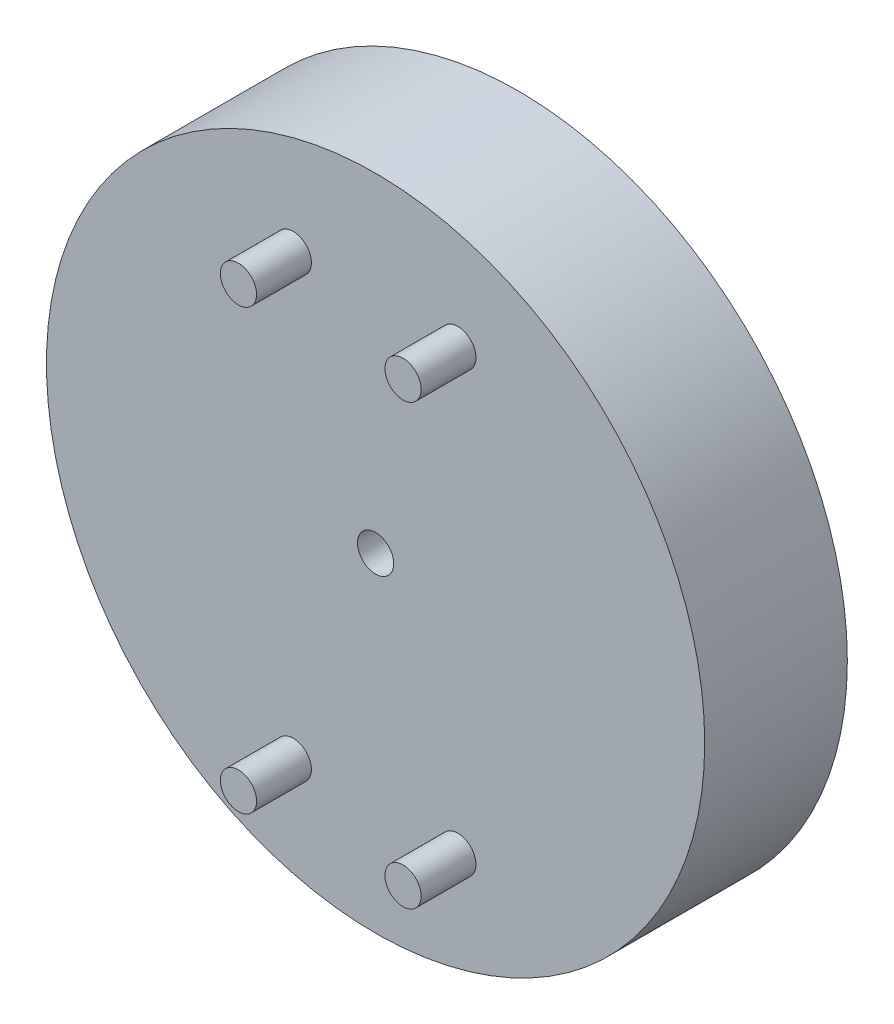
ISO-10303-21;
HEADER;
FILE_DESCRIPTION(('STEP AP214'),'2;1');
FILE_NAME('part.step','',(''),(''),'','','');
FILE_SCHEMA(('AUTOMOTIVE_DESIGN { 1 0 10303 214 1 1 1 1 }'));
ENDSEC;
DATA;
#1=APPLICATION_CONTEXT('core data for automotive mechanical design processes');
#2=APPLICATION_PROTOCOL_DEFINITION('international standard','automotive_design',2000,#1);
#3=PRODUCT_CONTEXT('',#1,'mechanical');
#4=PRODUCT('Part','Part','',(#3));
#5=PRODUCT_RELATED_PRODUCT_CATEGORY('part','',(#4));
#6=PRODUCT_DEFINITION_FORMATION('','',#4);
#7=PRODUCT_DEFINITION_CONTEXT('part definition',#1,'design');
#8=PRODUCT_DEFINITION('design','',#6,#7);
#9=PRODUCT_DEFINITION_SHAPE('','',#8);
#10=(LENGTH_UNIT() NAMED_UNIT(*) SI_UNIT(.MILLI.,.METRE.));
#11=(NAMED_UNIT(*) PLANE_ANGLE_UNIT() SI_UNIT($,.RADIAN.));
#12=(NAMED_UNIT(*) SI_UNIT($,.STERADIAN.) SOLID_ANGLE_UNIT());
#13=UNCERTAINTY_MEASURE_WITH_UNIT(LENGTH_MEASURE(1.E-05),#10,'distance_accuracy_value','');
#14=(GEOMETRIC_REPRESENTATION_CONTEXT(3) GLOBAL_UNCERTAINTY_ASSIGNED_CONTEXT((#13)) GLOBAL_UNIT_ASSIGNED_CONTEXT((#10,
#11,#12)) REPRESENTATION_CONTEXT('',''));
#15=CARTESIAN_POINT('',(0.,0.,0.));
#16=DIRECTION('',(0.,0.,1.));
#17=DIRECTION('',(1.,0.,0.));
#18=AXIS2_PLACEMENT_3D('',#15,#16,#17);
#19=CARTESIAN_POINT('',(0.,0.,-20.));
#20=DIRECTION('',(0.,0.,1.));
#21=DIRECTION('',(1.,0.,0.));
#22=AXIS2_PLACEMENT_3D('',#19,#20,#21);
#23=CYLINDRICAL_SURFACE('',#22,60.);
#24=CARTESIAN_POINT('',(0.,0.,-20.));
#25=DIRECTION('',(0.,0.,1.));
#26=DIRECTION('',(-1.,0.,0.));
#27=AXIS2_PLACEMENT_3D('',#24,#25,#26);
#28=CIRCLE('',#27,60.);
#29=CARTESIAN_POINT('',(60.,0.,-20.));
#30=VERTEX_POINT('',#29);
#31=EDGE_CURVE('E10',#30,#30,#28,.T.);
#32=CARTESIAN_POINT('',(0.,0.,6.));
#33=DIRECTION('',(0.,0.,1.));
#34=DIRECTION('',(-1.,0.,0.));
#35=AXIS2_PLACEMENT_3D('',#32,#33,#34);
#36=CIRCLE('',#35,60.);
#37=CARTESIAN_POINT('',(60.,0.,6.));
#38=VERTEX_POINT('',#37);
#39=EDGE_CURVE('E45',#38,#38,#36,.T.);
#40=CARTESIAN_POINT('',(60.,0.,-20.));
#41=CARTESIAN_POINT('',(60.,0.,-19.7291666666667));
#42=CARTESIAN_POINT('',(60.,0.,-19.4583333333333));
#43=CARTESIAN_POINT('',(60.,0.,-18.9166666666667));
#44=CARTESIAN_POINT('',(60.,0.,-18.6458333333333));
#45=CARTESIAN_POINT('',(60.,0.,-18.1041666666667));
#46=CARTESIAN_POINT('',(60.,0.,-17.8333333333333));
#47=CARTESIAN_POINT('',(60.,0.,-17.2916666666667));
#48=CARTESIAN_POINT('',(60.,0.,-17.0208333333333));
#49=CARTESIAN_POINT('',(60.,0.,-16.4791666666667));
#50=CARTESIAN_POINT('',(60.,0.,-16.2083333333333));
#51=CARTESIAN_POINT('',(60.,0.,-15.6666666666667));
#52=CARTESIAN_POINT('',(60.,0.,-15.3958333333333));
#53=CARTESIAN_POINT('',(60.,0.,-14.8541666666667));
#54=CARTESIAN_POINT('',(60.,0.,-14.5833333333333));
#55=CARTESIAN_POINT('',(60.,0.,-14.0416666666667));
#56=CARTESIAN_POINT('',(60.,0.,-13.7708333333333));
#57=CARTESIAN_POINT('',(60.,0.,-13.2291666666667));
#58=CARTESIAN_POINT('',(60.,0.,-12.9583333333333));
#59=CARTESIAN_POINT('',(60.,0.,-12.4166666666667));
#60=CARTESIAN_POINT('',(60.,0.,-12.1458333333333));
#61=CARTESIAN_POINT('',(60.,0.,-11.6041666666667));
#62=CARTESIAN_POINT('',(60.,0.,-11.3333333333333));
#63=CARTESIAN_POINT('',(60.,0.,-10.7916666666667));
#64=CARTESIAN_POINT('',(60.,0.,-10.5208333333333));
#65=CARTESIAN_POINT('',(60.,0.,-9.97916666666667));
#66=CARTESIAN_POINT('',(60.,0.,-9.70833333333333));
#67=CARTESIAN_POINT('',(60.,0.,-9.16666666666666));
#68=CARTESIAN_POINT('',(60.,0.,-8.89583333333333));
#69=CARTESIAN_POINT('',(60.,0.,-8.35416666666666));
#70=CARTESIAN_POINT('',(60.,0.,-8.08333333333333));
#71=CARTESIAN_POINT('',(60.,0.,-7.54166666666666));
#72=CARTESIAN_POINT('',(60.,0.,-7.27083333333333));
#73=CARTESIAN_POINT('',(60.,0.,-6.72916666666666));
#74=CARTESIAN_POINT('',(60.,0.,-6.45833333333333));
#75=CARTESIAN_POINT('',(60.,0.,-5.91666666666666));
#76=CARTESIAN_POINT('',(60.,0.,-5.64583333333333));
#77=CARTESIAN_POINT('',(60.,0.,-5.10416666666666));
#78=CARTESIAN_POINT('',(60.,0.,-4.83333333333333));
#79=CARTESIAN_POINT('',(60.,0.,-4.29166666666667));
#80=CARTESIAN_POINT('',(60.,0.,-4.02083333333333));
#81=CARTESIAN_POINT('',(60.,0.,-3.47916666666667));
#82=CARTESIAN_POINT('',(60.,0.,-3.20833333333333));
#83=CARTESIAN_POINT('',(60.,0.,-2.66666666666667));
#84=CARTESIAN_POINT('',(60.,0.,-2.39583333333333));
#85=CARTESIAN_POINT('',(60.,0.,-1.85416666666667));
#86=CARTESIAN_POINT('',(60.,0.,-1.58333333333333));
#87=CARTESIAN_POINT('',(60.,0.,-1.04166666666667));
#88=CARTESIAN_POINT('',(60.,0.,-0.770833333333334));
#89=CARTESIAN_POINT('',(60.,0.,-0.229166666666667));
#90=CARTESIAN_POINT('',(60.,0.,0.0416666666666667));
#91=CARTESIAN_POINT('',(60.,0.,0.583333333333334));
#92=CARTESIAN_POINT('',(60.,0.,0.854166666666667));
#93=CARTESIAN_POINT('',(60.,0.,1.39583333333333));
#94=CARTESIAN_POINT('',(60.,0.,1.66666666666667));
#95=CARTESIAN_POINT('',(60.,0.,2.20833333333334));
#96=CARTESIAN_POINT('',(60.,0.,2.47916666666667));
#97=CARTESIAN_POINT('',(60.,0.,3.02083333333333));
#98=CARTESIAN_POINT('',(60.,0.,3.29166666666667));
#99=CARTESIAN_POINT('',(60.,0.,3.83333333333333));
#100=CARTESIAN_POINT('',(60.,0.,4.10416666666667));
#101=CARTESIAN_POINT('',(60.,0.,4.64583333333333));
#102=CARTESIAN_POINT('',(60.,0.,4.91666666666667));
#103=CARTESIAN_POINT('',(60.,0.,5.45833333333333));
#104=CARTESIAN_POINT('',(60.,0.,5.72916666666667));
#105=CARTESIAN_POINT('',(60.,0.,6.));
#106=B_SPLINE_CURVE_WITH_KNOTS('',3,(#40,#41,#42,#43,#44,#45,#46,#47,#48,#49,#50,#51,#52,#53,
#54,#55,#56,#57,#58,#59,#60,#61,#62,#63,#64,#65,#66,#67,#68,#69,#70,#71,#72,#73,#74,#75,#76,#77,
#78,#79,#80,#81,#82,#83,#84,#85,#86,#87,#88,#89,#90,#91,#92,#93,#94,#95,#96,#97,#98,#99,#100,
#101,#102,#103,#104,#105),.UNSPECIFIED.,.F.,.F.,(4,2,2,2,2,2,2,2,2,2,2,2,2,2,2,2,2,2,2,2,2,2,2,
2,2,2,2,2,2,2,2,2,4),(0.,0.812500000000001,1.625,2.4375,3.25,4.0625,4.875,5.6875,6.5,7.3125,
8.125,8.9375,9.75,10.5625,11.375,12.1875,13.,13.8125,14.625,15.4375,16.25,17.0625,17.875,
18.6875,19.5,20.3125,21.125,21.9375,22.75,23.5625,24.375,25.1875,26.),.UNSPECIFIED.);
#107=EDGE_CURVE('BSEAM37',#30,#38,#106,.T.);
#108=ORIENTED_EDGE('',*,*,#31,.T.);
#109=ORIENTED_EDGE('',*,*,#39,.F.);
#110=ORIENTED_EDGE('',*,*,#107,.T.);
#111=ORIENTED_EDGE('',*,*,#107,.F.);
#112=EDGE_LOOP('',(#108,#110,#109,#111));
#113=FACE_BOUND('',#112,.T.);
#114=ADVANCED_FACE('F37',(#113),#23,.T.);
#115=CARTESIAN_POINT('',(0.,0.,-20.));
#116=DIRECTION('',(0.,0.,-1.));
#117=DIRECTION('',(-1.,0.,0.));
#118=AXIS2_PLACEMENT_3D('',#115,#116,#117);
#119=PLANE('',#118);
#120=CARTESIAN_POINT('',(0.,0.,-20.));
#121=DIRECTION('',(0.,0.,1.));
#122=DIRECTION('',(-1.,0.,0.));
#123=AXIS2_PLACEMENT_3D('',#120,#121,#122);
#124=CIRCLE('',#123,3.3);
#125=CARTESIAN_POINT('',(3.3,0.,-20.));
#126=VERTEX_POINT('',#125);
#127=EDGE_CURVE('E51',#126,#126,#124,.T.);
#128=ORIENTED_EDGE('',*,*,#127,.T.);
#129=EDGE_LOOP('',(#128));
#130=FACE_BOUND('',#129,.T.);
#131=ORIENTED_EDGE('',*,*,#31,.F.);
#132=EDGE_LOOP('',(#131));
#133=FACE_BOUND('',#132,.T.);
#134=ADVANCED_FACE('F100',(#130,#133),#119,.T.);
#135=CARTESIAN_POINT('',(0.,0.,6.));
#136=DIRECTION('',(0.,0.,-1.));
#137=DIRECTION('',(-1.,0.,0.));
#138=AXIS2_PLACEMENT_3D('',#135,#136,#137);
#139=PLANE('',#138);
#140=CARTESIAN_POINT('',(-14.999999494815,-40.,6.));
#141=DIRECTION('',(0.,0.,-1.));
#142=DIRECTION('',(-1.,0.,0.));
#143=AXIS2_PLACEMENT_3D('',#140,#141,#142);
#144=CIRCLE('',#143,3.3);
#145=CARTESIAN_POINT('',(-18.299999494815,-40.,6.));
#146=VERTEX_POINT('',#145);
#147=EDGE_CURVE('E40',#146,#146,#144,.T.);
#148=ORIENTED_EDGE('',*,*,#147,.T.);
#149=EDGE_LOOP('',(#148));
#150=FACE_BOUND('',#149,.T.);
#151=CARTESIAN_POINT('',(14.999999494815,-40.,6.));
#152=DIRECTION('',(0.,0.,-1.));
#153=DIRECTION('',(-1.,0.,0.));
#154=AXIS2_PLACEMENT_3D('',#151,#152,#153);
#155=CIRCLE('',#154,3.3);
#156=CARTESIAN_POINT('',(11.699999494815,-40.,6.));
#157=VERTEX_POINT('',#156);
#158=EDGE_CURVE('E66',#157,#157,#155,.T.);
#159=ORIENTED_EDGE('',*,*,#158,.T.);
#160=EDGE_LOOP('',(#159));
#161=FACE_BOUND('',#160,.T.);
#162=CARTESIAN_POINT('',(-14.999999494815,40.,6.));
#163=DIRECTION('',(0.,0.,-1.));
#164=DIRECTION('',(-1.,0.,0.));
#165=AXIS2_PLACEMENT_3D('',#162,#163,#164);
#166=CIRCLE('',#165,3.3);
#167=CARTESIAN_POINT('',(-18.299999494815,40.,6.));
#168=VERTEX_POINT('',#167);
#169=EDGE_CURVE('E62',#168,#168,#166,.T.);
#170=ORIENTED_EDGE('',*,*,#169,.T.);
#171=EDGE_LOOP('',(#170));
#172=FACE_BOUND('',#171,.T.);
#173=CARTESIAN_POINT('',(14.999999494815,40.,6.));
#174=DIRECTION('',(0.,0.,-1.));
#175=DIRECTION('',(-1.,0.,0.));
#176=AXIS2_PLACEMENT_3D('',#173,#174,#175);
#177=CIRCLE('',#176,3.3);
#178=CARTESIAN_POINT('',(11.699999494815,40.,6.));
#179=VERTEX_POINT('',#178);
#180=EDGE_CURVE('E57',#179,#179,#177,.T.);
#181=ORIENTED_EDGE('',*,*,#180,.T.);
#182=EDGE_LOOP('',(#181));
#183=FACE_BOUND('',#182,.T.);
#184=CARTESIAN_POINT('',(0.,0.,6.));
#185=DIRECTION('',(0.,0.,1.));
#186=DIRECTION('',(-1.,0.,0.));
#187=AXIS2_PLACEMENT_3D('',#184,#185,#186);
#188=CIRCLE('',#187,3.3);
#189=CARTESIAN_POINT('',(3.3,0.,6.));
#190=VERTEX_POINT('',#189);
#191=EDGE_CURVE('E54',#190,#190,#188,.T.);
#192=ORIENTED_EDGE('',*,*,#191,.F.);
#193=EDGE_LOOP('',(#192));
#194=FACE_BOUND('',#193,.T.);
#195=ORIENTED_EDGE('',*,*,#39,.T.);
#196=EDGE_LOOP('',(#195));
#197=FACE_BOUND('',#196,.T.);
#198=ADVANCED_FACE('F97',(#150,#161,#172,#183,#194,#197),#139,.F.);
#199=CARTESIAN_POINT('',(0.,0.,-20.));
#200=DIRECTION('',(0.,0.,1.));
#201=DIRECTION('',(1.,0.,0.));
#202=AXIS2_PLACEMENT_3D('',#199,#200,#201);
#203=CYLINDRICAL_SURFACE('',#202,3.3);
#204=CARTESIAN_POINT('',(3.3,0.,-20.));
#205=CARTESIAN_POINT('',(3.3,0.,-19.7291666666667));
#206=CARTESIAN_POINT('',(3.3,0.,-19.4583333333333));
#207=CARTESIAN_POINT('',(3.3,0.,-18.9166666666667));
#208=CARTESIAN_POINT('',(3.3,0.,-18.6458333333333));
#209=CARTESIAN_POINT('',(3.3,0.,-18.1041666666667));
#210=CARTESIAN_POINT('',(3.3,0.,-17.8333333333333));
#211=CARTESIAN_POINT('',(3.3,0.,-17.2916666666667));
#212=CARTESIAN_POINT('',(3.3,0.,-17.0208333333333));
#213=CARTESIAN_POINT('',(3.3,0.,-16.4791666666667));
#214=CARTESIAN_POINT('',(3.3,0.,-16.2083333333333));
#215=CARTESIAN_POINT('',(3.3,0.,-15.6666666666667));
#216=CARTESIAN_POINT('',(3.3,0.,-15.3958333333333));
#217=CARTESIAN_POINT('',(3.3,0.,-14.8541666666667));
#218=CARTESIAN_POINT('',(3.3,0.,-14.5833333333333));
#219=CARTESIAN_POINT('',(3.3,0.,-14.0416666666667));
#220=CARTESIAN_POINT('',(3.3,0.,-13.7708333333333));
#221=CARTESIAN_POINT('',(3.3,0.,-13.2291666666667));
#222=CARTESIAN_POINT('',(3.3,0.,-12.9583333333333));
#223=CARTESIAN_POINT('',(3.3,0.,-12.4166666666667));
#224=CARTESIAN_POINT('',(3.3,0.,-12.1458333333333));
#225=CARTESIAN_POINT('',(3.3,0.,-11.6041666666667));
#226=CARTESIAN_POINT('',(3.3,0.,-11.3333333333333));
#227=CARTESIAN_POINT('',(3.3,0.,-10.7916666666667));
#228=CARTESIAN_POINT('',(3.3,0.,-10.5208333333333));
#229=CARTESIAN_POINT('',(3.3,0.,-9.97916666666667));
#230=CARTESIAN_POINT('',(3.3,0.,-9.70833333333333));
#231=CARTESIAN_POINT('',(3.3,0.,-9.16666666666667));
#232=CARTESIAN_POINT('',(3.3,0.,-8.89583333333333));
#233=CARTESIAN_POINT('',(3.3,0.,-8.35416666666667));
#234=CARTESIAN_POINT('',(3.3,0.,-8.08333333333333));
#235=CARTESIAN_POINT('',(3.3,0.,-7.54166666666667));
#236=CARTESIAN_POINT('',(3.3,0.,-7.27083333333333));
#237=CARTESIAN_POINT('',(3.3,0.,-6.72916666666667));
#238=CARTESIAN_POINT('',(3.3,0.,-6.45833333333333));
#239=CARTESIAN_POINT('',(3.3,0.,-5.91666666666667));
#240=CARTESIAN_POINT('',(3.3,0.,-5.64583333333333));
#241=CARTESIAN_POINT('',(3.3,0.,-5.10416666666667));
#242=CARTESIAN_POINT('',(3.3,0.,-4.83333333333333));
#243=CARTESIAN_POINT('',(3.3,0.,-4.29166666666667));
#244=CARTESIAN_POINT('',(3.3,0.,-4.02083333333333));
#245=CARTESIAN_POINT('',(3.3,0.,-3.47916666666667));
#246=CARTESIAN_POINT('',(3.3,0.,-3.20833333333333));
#247=CARTESIAN_POINT('',(3.3,0.,-2.66666666666667));
#248=CARTESIAN_POINT('',(3.3,0.,-2.39583333333333));
#249=CARTESIAN_POINT('',(3.3,0.,-1.85416666666666));
#250=CARTESIAN_POINT('',(3.3,0.,-1.58333333333333));
#251=CARTESIAN_POINT('',(3.3,0.,-1.04166666666666));
#252=CARTESIAN_POINT('',(3.3,0.,-0.770833333333331));
#253=CARTESIAN_POINT('',(3.3,0.,-0.229166666666665));
#254=CARTESIAN_POINT('',(3.3,0.,0.0416666666666679));
#255=CARTESIAN_POINT('',(3.3,0.,0.583333333333334));
#256=CARTESIAN_POINT('',(3.3,0.,0.854166666666668));
#257=CARTESIAN_POINT('',(3.3,0.,1.39583333333333));
#258=CARTESIAN_POINT('',(3.3,0.,1.66666666666667));
#259=CARTESIAN_POINT('',(3.3,0.,2.20833333333334));
#260=CARTESIAN_POINT('',(3.3,0.,2.47916666666667));
#261=CARTESIAN_POINT('',(3.3,0.,3.02083333333334));
#262=CARTESIAN_POINT('',(3.3,0.,3.29166666666667));
#263=CARTESIAN_POINT('',(3.3,0.,3.83333333333334));
#264=CARTESIAN_POINT('',(3.3,0.,4.10416666666667));
#265=CARTESIAN_POINT('',(3.3,0.,4.64583333333333));
#266=CARTESIAN_POINT('',(3.3,0.,4.91666666666667));
#267=CARTESIAN_POINT('',(3.3,0.,5.45833333333333));
#268=CARTESIAN_POINT('',(3.3,0.,5.72916666666667));
#269=CARTESIAN_POINT('',(3.3,0.,6.));
#270=B_SPLINE_CURVE_WITH_KNOTS('',3,(#204,#205,#206,#207,#208,#209,#210,#211,#212,#213,#214,
#215,#216,#217,#218,#219,#220,#221,#222,#223,#224,#225,#226,#227,#228,#229,#230,#231,#232,#233,
#234,#235,#236,#237,#238,#239,#240,#241,#242,#243,#244,#245,#246,#247,#248,#249,#250,#251,#252,
#253,#254,#255,#256,#257,#258,#259,#260,#261,#262,#263,#264,#265,#266,#267,#268,#269),
.UNSPECIFIED.,.F.,.F.,(4,2,2,2,2,2,2,2,2,2,2,2,2,2,2,2,2,2,2,2,2,2,2,2,2,2,2,2,2,2,2,2,4),(0.,
0.812499999999997,1.625,2.4375,3.25,4.0625,4.875,5.6875,6.5,7.3125,8.125,8.9375,9.75,10.5625,
11.375,12.1875,13.,13.8125,14.625,15.4375,16.25,17.0625,17.875,18.6875,19.5,20.3125,21.125,
21.9375,22.75,23.5625,24.375,25.1875,26.),.UNSPECIFIED.);
#271=EDGE_CURVE('BSEAM95',#126,#190,#270,.T.);
#272=ORIENTED_EDGE('',*,*,#127,.F.);
#273=ORIENTED_EDGE('',*,*,#191,.T.);
#274=ORIENTED_EDGE('',*,*,#271,.T.);
#275=ORIENTED_EDGE('',*,*,#271,.F.);
#276=EDGE_LOOP('',(#272,#274,#273,#275));
#277=FACE_BOUND('',#276,.T.);
#278=ADVANCED_FACE('F95',(#277),#203,.F.);
#279=CARTESIAN_POINT('',(14.999999494815,40.,16.));
#280=DIRECTION('',(0.,0.,-1.));
#281=DIRECTION('',(-1.,0.,0.));
#282=AXIS2_PLACEMENT_3D('',#279,#280,#281);
#283=CYLINDRICAL_SURFACE('',#282,3.3);
#284=CARTESIAN_POINT('',(14.999999494815,40.,16.));
#285=DIRECTION('',(0.,0.,-1.));
#286=DIRECTION('',(-1.,0.,0.));
#287=AXIS2_PLACEMENT_3D('',#284,#285,#286);
#288=CIRCLE('',#287,3.3);
#289=CARTESIAN_POINT('',(11.699999494815,40.,16.));
#290=VERTEX_POINT('',#289);
#291=EDGE_CURVE('E61',#290,#290,#288,.T.);
#292=ORIENTED_EDGE('',*,*,#291,.T.);
#293=EDGE_LOOP('',(#292));
#294=FACE_BOUND('',#293,.T.);
#295=ORIENTED_EDGE('',*,*,#180,.F.);
#296=EDGE_LOOP('',(#295));
#297=FACE_BOUND('',#296,.T.);
#298=ADVANCED_FACE('F115',(#294,#297),#283,.T.);
#299=CARTESIAN_POINT('',(14.999999494815,40.,16.));
#300=DIRECTION('',(0.,0.,-1.));
#301=DIRECTION('',(-1.,0.,0.));
#302=AXIS2_PLACEMENT_3D('',#299,#300,#301);
#303=PLANE('',#302);
#304=ORIENTED_EDGE('',*,*,#291,.F.);
#305=EDGE_LOOP('',(#304));
#306=FACE_BOUND('',#305,.T.);
#307=ADVANCED_FACE('F119',(#306),#303,.F.);
#308=CARTESIAN_POINT('',(-14.999999494815,40.,16.));
#309=DIRECTION('',(0.,0.,-1.));
#310=DIRECTION('',(-1.,0.,0.));
#311=AXIS2_PLACEMENT_3D('',#308,#309,#310);
#312=CYLINDRICAL_SURFACE('',#311,3.3);
#313=CARTESIAN_POINT('',(-14.999999494815,40.,16.));
#314=DIRECTION('',(0.,0.,-1.));
#315=DIRECTION('',(-1.,0.,0.));
#316=AXIS2_PLACEMENT_3D('',#313,#314,#315);
#317=CIRCLE('',#316,3.3);
#318=CARTESIAN_POINT('',(-18.299999494815,40.,16.));
#319=VERTEX_POINT('',#318);
#320=EDGE_CURVE('E65',#319,#319,#317,.T.);
#321=ORIENTED_EDGE('',*,*,#320,.T.);
#322=EDGE_LOOP('',(#321));
#323=FACE_BOUND('',#322,.T.);
#324=ORIENTED_EDGE('',*,*,#169,.F.);
#325=EDGE_LOOP('',(#324));
#326=FACE_BOUND('',#325,.T.);
#327=ADVANCED_FACE('F123',(#323,#326),#312,.T.);
#328=CARTESIAN_POINT('',(-14.999999494815,40.,16.));
#329=DIRECTION('',(0.,0.,-1.));
#330=DIRECTION('',(-1.,0.,0.));
#331=AXIS2_PLACEMENT_3D('',#328,#329,#330);
#332=PLANE('',#331);
#333=ORIENTED_EDGE('',*,*,#320,.F.);
#334=EDGE_LOOP('',(#333));
#335=FACE_BOUND('',#334,.T.);
#336=ADVANCED_FACE('F127',(#335),#332,.F.);
#337=CARTESIAN_POINT('',(14.999999494815,-40.,16.));
#338=DIRECTION('',(0.,0.,-1.));
#339=DIRECTION('',(-1.,0.,0.));
#340=AXIS2_PLACEMENT_3D('',#337,#338,#339);
#341=CYLINDRICAL_SURFACE('',#340,3.3);
#342=CARTESIAN_POINT('',(14.999999494815,-40.,16.));
#343=DIRECTION('',(0.,0.,-1.));
#344=DIRECTION('',(-1.,0.,0.));
#345=AXIS2_PLACEMENT_3D('',#342,#343,#344);
#346=CIRCLE('',#345,3.3);
#347=CARTESIAN_POINT('',(11.699999494815,-40.,16.));
#348=VERTEX_POINT('',#347);
#349=EDGE_CURVE('E69',#348,#348,#346,.T.);
#350=ORIENTED_EDGE('',*,*,#349,.T.);
#351=EDGE_LOOP('',(#350));
#352=FACE_BOUND('',#351,.T.);
#353=ORIENTED_EDGE('',*,*,#158,.F.);
#354=EDGE_LOOP('',(#353));
#355=FACE_BOUND('',#354,.T.);
#356=ADVANCED_FACE('F131',(#352,#355),#341,.T.);
#357=CARTESIAN_POINT('',(14.999999494815,-40.,16.));
#358=DIRECTION('',(0.,0.,-1.));
#359=DIRECTION('',(-1.,0.,0.));
#360=AXIS2_PLACEMENT_3D('',#357,#358,#359);
#361=PLANE('',#360);
#362=ORIENTED_EDGE('',*,*,#349,.F.);
#363=EDGE_LOOP('',(#362));
#364=FACE_BOUND('',#363,.T.);
#365=ADVANCED_FACE('F135',(#364),#361,.F.);
#366=CARTESIAN_POINT('',(-14.999999494815,-40.,16.));
#367=DIRECTION('',(0.,0.,-1.));
#368=DIRECTION('',(-1.,0.,0.));
#369=AXIS2_PLACEMENT_3D('',#366,#367,#368);
#370=CYLINDRICAL_SURFACE('',#369,3.3);
#371=CARTESIAN_POINT('',(-14.999999494815,-40.,16.));
#372=DIRECTION('',(0.,0.,-1.));
#373=DIRECTION('',(-1.,0.,0.));
#374=AXIS2_PLACEMENT_3D('',#371,#372,#373);
#375=CIRCLE('',#374,3.3);
#376=CARTESIAN_POINT('',(-18.299999494815,-40.,16.));
#377=VERTEX_POINT('',#376);
#378=EDGE_CURVE('E82',#377,#377,#375,.T.);
#379=ORIENTED_EDGE('',*,*,#378,.T.);
#380=EDGE_LOOP('',(#379));
#381=FACE_BOUND('',#380,.T.);
#382=ORIENTED_EDGE('',*,*,#147,.F.);
#383=EDGE_LOOP('',(#382));
#384=FACE_BOUND('',#383,.T.);
#385=ADVANCED_FACE('F138',(#381,#384),#370,.T.);
#386=CARTESIAN_POINT('',(-14.999999494815,-40.,16.));
#387=DIRECTION('',(0.,0.,-1.));
#388=DIRECTION('',(-1.,0.,0.));
#389=AXIS2_PLACEMENT_3D('',#386,#387,#388);
#390=PLANE('',#389);
#391=ORIENTED_EDGE('',*,*,#378,.F.);
#392=EDGE_LOOP('',(#391));
#393=FACE_BOUND('',#392,.T.);
#394=ADVANCED_FACE('F142',(#393),#390,.F.);
#395=CLOSED_SHELL('',(#114,#134,#198,#278,#298,#307,#327,#336,#356,#365,#385,#394));
#396=MANIFOLD_SOLID_BREP('B2',#395);
#397=ADVANCED_BREP_SHAPE_REPRESENTATION('',(#18,#396),#14);
#398=SHAPE_DEFINITION_REPRESENTATION(#9,#397);
ENDSEC;
END-ISO-10303-21;
